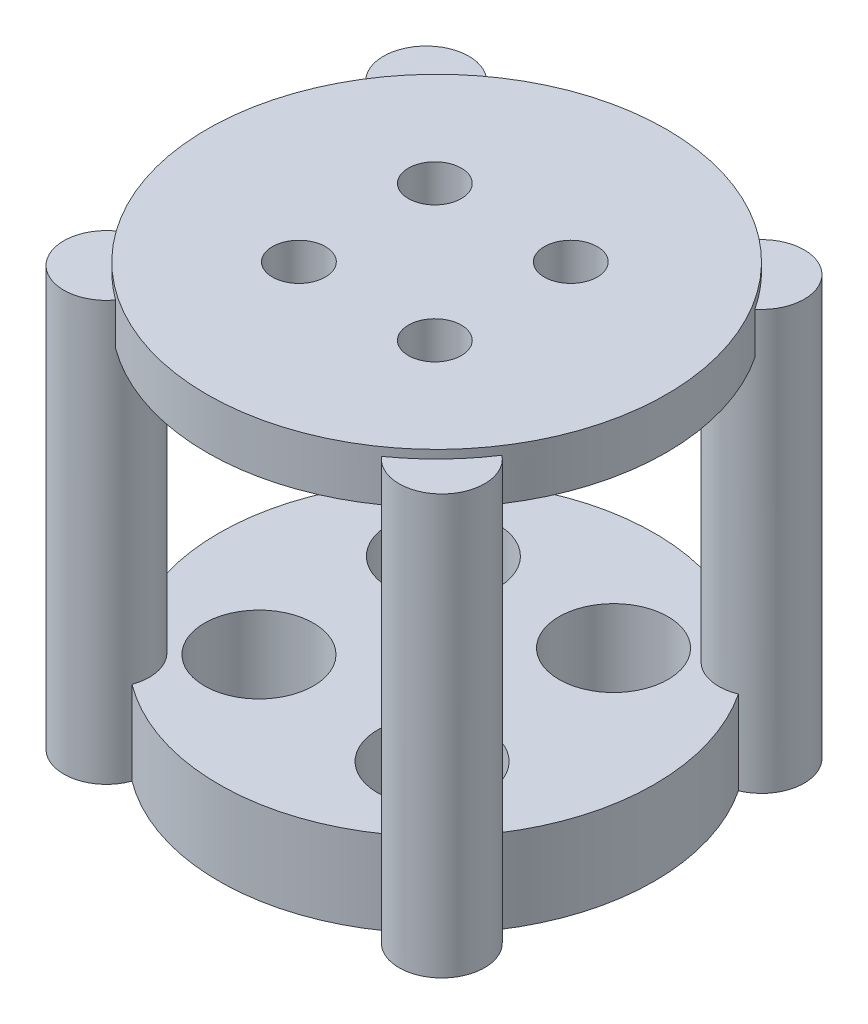
ISO-10303-21;
HEADER;
FILE_DESCRIPTION(('STEP AP214'),'2;1');
FILE_NAME('part.step','',(''),(''),'','','');
FILE_SCHEMA(('AUTOMOTIVE_DESIGN { 1 0 10303 214 1 1 1 1 }'));
ENDSEC;
DATA;
#1=APPLICATION_CONTEXT('core data for automotive mechanical design processes');
#2=APPLICATION_PROTOCOL_DEFINITION('international standard','automotive_design',2000,#1);
#3=PRODUCT_CONTEXT('',#1,'mechanical');
#4=PRODUCT('Part','Part','',(#3));
#5=PRODUCT_RELATED_PRODUCT_CATEGORY('part','',(#4));
#6=PRODUCT_DEFINITION_FORMATION('','',#4);
#7=PRODUCT_DEFINITION_CONTEXT('part definition',#1,'design');
#8=PRODUCT_DEFINITION('design','',#6,#7);
#9=PRODUCT_DEFINITION_SHAPE('','',#8);
#10=(LENGTH_UNIT() NAMED_UNIT(*) SI_UNIT(.MILLI.,.METRE.));
#11=(NAMED_UNIT(*) PLANE_ANGLE_UNIT() SI_UNIT($,.RADIAN.));
#12=(NAMED_UNIT(*) SI_UNIT($,.STERADIAN.) SOLID_ANGLE_UNIT());
#13=UNCERTAINTY_MEASURE_WITH_UNIT(LENGTH_MEASURE(1.E-05),#10,'distance_accuracy_value','');
#14=(GEOMETRIC_REPRESENTATION_CONTEXT(3) GLOBAL_UNCERTAINTY_ASSIGNED_CONTEXT((#13)) GLOBAL_UNIT_ASSIGNED_CONTEXT((#10,
#11,#12)) REPRESENTATION_CONTEXT('',''));
#15=CARTESIAN_POINT('',(0.,0.,0.));
#16=DIRECTION('',(0.,0.,1.));
#17=DIRECTION('',(1.,0.,0.));
#18=AXIS2_PLACEMENT_3D('',#15,#16,#17);
#19=CARTESIAN_POINT('',(0.,10.,0.));
#20=DIRECTION('',(0.,-1.,0.));
#21=DIRECTION('',(0.,0.,-1.));
#22=AXIS2_PLACEMENT_3D('',#19,#20,#21);
#23=CYLINDRICAL_SURFACE('',#22,25.9690851786537);
#24=CARTESIAN_POINT('',(0.,0.,0.));
#25=DIRECTION('',(0.,1.,0.));
#26=DIRECTION('',(0.,0.,1.));
#27=AXIS2_PLACEMENT_3D('',#24,#25,#26);
#28=CIRCLE('',#27,25.9690851786537);
#29=CARTESIAN_POINT('',(-15.5248521141573,0.,20.8175971680142));
#30=VERTEX_POINT('',#29);
#31=CARTESIAN_POINT('',(15.0373155756962,0.,21.1724473146846));
#32=VERTEX_POINT('',#31);
#33=EDGE_CURVE('E187',#30,#32,#28,.T.);
#34=ORIENTED_EDGE('',*,*,#33,.T.);
#35=DIRECTION('',(0.,-1.,0.));
#36=VECTOR('',#35,1.);
#37=CARTESIAN_POINT('',(15.0373155756962,25.,21.1724473146846));
#38=LINE('',#37,#36);
#39=CARTESIAN_POINT('',(15.0373155756962,10.,21.1724473146846));
#40=VERTEX_POINT('',#39);
#41=EDGE_CURVE('E237',#32,#40,#38,.F.);
#42=ORIENTED_EDGE('',*,*,#41,.T.);
#43=CARTESIAN_POINT('',(0.,10.,0.));
#44=DIRECTION('',(0.,1.,0.));
#45=DIRECTION('',(0.,0.,1.));
#46=AXIS2_PLACEMENT_3D('',#43,#44,#45);
#47=CIRCLE('',#46,25.9690851786537);
#48=CARTESIAN_POINT('',(-15.5248521141573,10.,20.8175971680142));
#49=VERTEX_POINT('',#48);
#50=EDGE_CURVE('E167',#49,#40,#47,.T.);
#51=ORIENTED_EDGE('',*,*,#50,.F.);
#52=DIRECTION('',(0.,-1.,0.));
#53=VECTOR('',#52,1.);
#54=CARTESIAN_POINT('',(-15.5248521141574,25.,20.8175971680142));
#55=LINE('',#54,#53);
#56=EDGE_CURVE('E228',#49,#30,#55,.T.);
#57=ORIENTED_EDGE('',*,*,#56,.T.);
#58=EDGE_LOOP('',(#34,#42,#51,#57));
#59=FACE_BOUND('',#58,.T.);
#60=ADVANCED_FACE('F33',(#59),#23,.T.);
#61=CARTESIAN_POINT('',(-21.7610217360415,0.,-14.1722022995616));
#62=VERTEX_POINT('',#61);
#63=CARTESIAN_POINT('',(-21.7610217360415,0.,14.1722022995616));
#64=VERTEX_POINT('',#63);
#65=EDGE_CURVE('E186',#62,#64,#28,.T.);
#66=ORIENTED_EDGE('',*,*,#65,.T.);
#67=DIRECTION('',(0.,-1.,0.));
#68=VECTOR('',#67,1.);
#69=CARTESIAN_POINT('',(-21.7610217360415,25.,14.1722022995616));
#70=LINE('',#69,#68);
#71=CARTESIAN_POINT('',(-21.7610217360415,10.,14.1722022995616));
#72=VERTEX_POINT('',#71);
#73=EDGE_CURVE('E224',#64,#72,#70,.F.);
#74=ORIENTED_EDGE('',*,*,#73,.T.);
#75=CARTESIAN_POINT('',(-21.7610217360415,10.,-14.1722022995616));
#76=VERTEX_POINT('',#75);
#77=EDGE_CURVE('E166',#76,#72,#47,.T.);
#78=ORIENTED_EDGE('',*,*,#77,.F.);
#79=DIRECTION('',(0.,-1.,0.));
#80=VECTOR('',#79,1.);
#81=CARTESIAN_POINT('',(-21.7610217360415,25.,-14.1722022995616));
#82=LINE('',#81,#80);
#83=EDGE_CURVE('E204',#62,#76,#82,.F.);
#84=ORIENTED_EDGE('',*,*,#83,.F.);
#85=EDGE_LOOP('',(#66,#74,#78,#84));
#86=FACE_BOUND('',#85,.T.);
#87=ADVANCED_FACE('F340',(#86),#23,.T.);
#88=CARTESIAN_POINT('',(21.6415336495583,10.,14.3540031458546));
#89=VERTEX_POINT('',#88);
#90=CARTESIAN_POINT('',(21.6415336495583,10.,-14.3540031458546));
#91=VERTEX_POINT('',#90);
#92=EDGE_CURVE('E169',#89,#91,#47,.T.);
#93=ORIENTED_EDGE('',*,*,#92,.F.);
#94=DIRECTION('',(0.,-1.,0.));
#95=VECTOR('',#94,1.);
#96=CARTESIAN_POINT('',(21.6415336495583,25.,14.3540031458546));
#97=LINE('',#96,#95);
#98=CARTESIAN_POINT('',(21.6415336495583,0.,14.3540031458546));
#99=VERTEX_POINT('',#98);
#100=EDGE_CURVE('E242',#89,#99,#97,.T.);
#101=ORIENTED_EDGE('',*,*,#100,.T.);
#102=CARTESIAN_POINT('',(21.6415336495583,0.,-14.3540031458546));
#103=VERTEX_POINT('',#102);
#104=EDGE_CURVE('E188',#99,#103,#28,.T.);
#105=ORIENTED_EDGE('',*,*,#104,.T.);
#106=DIRECTION('',(0.,-1.,0.));
#107=VECTOR('',#106,1.);
#108=CARTESIAN_POINT('',(21.6415336495583,25.,-14.3540031458546));
#109=LINE('',#108,#107);
#110=EDGE_CURVE('E212',#91,#103,#109,.T.);
#111=ORIENTED_EDGE('',*,*,#110,.F.);
#112=EDGE_LOOP('',(#93,#101,#105,#111));
#113=FACE_BOUND('',#112,.T.);
#114=ADVANCED_FACE('F35',(#113),#23,.T.);
#115=DIRECTION('',(0.,-1.,0.));
#116=VECTOR('',#115,1.);
#117=CARTESIAN_POINT('',(15.0373155756962,25.,-21.1724473146846));
#118=LINE('',#117,#116);
#119=CARTESIAN_POINT('',(15.0373155756962,0.,-21.1724473146846));
#120=VERTEX_POINT('',#119);
#121=CARTESIAN_POINT('',(15.0373155756962,10.,-21.1724473146846));
#122=VERTEX_POINT('',#121);
#123=EDGE_CURVE('E216',#120,#122,#118,.F.);
#124=ORIENTED_EDGE('',*,*,#123,.F.);
#125=CARTESIAN_POINT('',(-15.5248521141574,0.,-20.8175971680142));
#126=VERTEX_POINT('',#125);
#127=EDGE_CURVE('E175',#120,#126,#28,.T.);
#128=ORIENTED_EDGE('',*,*,#127,.T.);
#129=DIRECTION('',(0.,-1.,0.));
#130=VECTOR('',#129,1.);
#131=CARTESIAN_POINT('',(-15.5248521141574,25.,-20.8175971680142));
#132=LINE('',#131,#130);
#133=CARTESIAN_POINT('',(-15.5248521141573,10.,-20.8175971680142));
#134=VERTEX_POINT('',#133);
#135=EDGE_CURVE('E197',#134,#126,#132,.T.);
#136=ORIENTED_EDGE('',*,*,#135,.F.);
#137=EDGE_CURVE('E170',#122,#134,#47,.T.);
#138=ORIENTED_EDGE('',*,*,#137,.F.);
#139=EDGE_LOOP('',(#124,#128,#136,#138));
#140=FACE_BOUND('',#139,.T.);
#141=ADVANCED_FACE('F346',(#140),#23,.T.);
#142=CARTESIAN_POINT('',(0.,10.,0.));
#143=DIRECTION('',(0.,1.,0.));
#144=DIRECTION('',(0.,0.,1.));
#145=AXIS2_PLACEMENT_3D('',#142,#143,#144);
#146=PLANE('',#145);
#147=CARTESIAN_POINT('',(19.6836744663351,10.,19.0652406108791));
#148=DIRECTION('',(0.,1.,0.));
#149=DIRECTION('',(0.,0.,1.));
#150=AXIS2_PLACEMENT_3D('',#147,#148,#149);
#151=CIRCLE('',#150,5.10185956619563);
#152=EDGE_CURVE('E150',#89,#40,#151,.T.);
#153=ORIENTED_EDGE('',*,*,#152,.F.);
#154=ORIENTED_EDGE('',*,*,#92,.T.);
#155=CARTESIAN_POINT('',(19.6836744663351,10.,-19.0652406108791));
#156=DIRECTION('',(0.,1.,0.));
#157=DIRECTION('',(0.,0.,1.));
#158=AXIS2_PLACEMENT_3D('',#155,#156,#157);
#159=CIRCLE('',#158,5.10185956619563);
#160=EDGE_CURVE('E218',#91,#122,#159,.F.);
#161=ORIENTED_EDGE('',*,*,#160,.T.);
#162=ORIENTED_EDGE('',*,*,#137,.T.);
#163=CARTESIAN_POINT('',(-20.3163255336649,10.,-19.0652406108791));
#164=DIRECTION('',(0.,1.,0.));
#165=DIRECTION('',(0.,0.,1.));
#166=AXIS2_PLACEMENT_3D('',#163,#164,#165);
#167=CIRCLE('',#166,5.10185956619563);
#168=EDGE_CURVE('E206',#134,#76,#167,.F.);
#169=ORIENTED_EDGE('',*,*,#168,.T.);
#170=ORIENTED_EDGE('',*,*,#77,.T.);
#171=CARTESIAN_POINT('',(-20.3163255336649,10.,19.0652406108791));
#172=DIRECTION('',(0.,1.,0.));
#173=DIRECTION('',(0.,0.,1.));
#174=AXIS2_PLACEMENT_3D('',#171,#172,#173);
#175=CIRCLE('',#174,5.10185956619563);
#176=EDGE_CURVE('E230',#49,#72,#175,.T.);
#177=ORIENTED_EDGE('',*,*,#176,.F.);
#178=ORIENTED_EDGE('',*,*,#50,.T.);
#179=EDGE_LOOP('',(#153,#154,#161,#162,#169,#170,#177,#178));
#180=FACE_BOUND('',#179,.T.);
#181=CARTESIAN_POINT('',(9.44894330462829,10.,-11.6497841364516));
#182=DIRECTION('',(0.,1.,0.));
#183=DIRECTION('',(0.,0.,1.));
#184=AXIS2_PLACEMENT_3D('',#181,#182,#183);
#185=CIRCLE('',#184,6.5);
#186=CARTESIAN_POINT('',(9.44894330462829,10.,-5.14978413645163));
#187=VERTEX_POINT('',#186);
#188=EDGE_CURVE('E193',#187,#187,#185,.T.);
#189=ORIENTED_EDGE('',*,*,#188,.F.);
#190=EDGE_LOOP('',(#189));
#191=FACE_BOUND('',#190,.T.);
#192=CARTESIAN_POINT('',(10.3303987443531,10.,10.8757924668811));
#193=DIRECTION('',(0.,1.,0.));
#194=DIRECTION('',(0.,0.,1.));
#195=AXIS2_PLACEMENT_3D('',#192,#193,#194);
#196=CIRCLE('',#195,6.5);
#197=CARTESIAN_POINT('',(10.3303987443531,10.,17.3757924668811));
#198=VERTEX_POINT('',#197);
#199=EDGE_CURVE('E196',#198,#198,#196,.T.);
#200=ORIENTED_EDGE('',*,*,#199,.F.);
#201=EDGE_LOOP('',(#200));
#202=FACE_BOUND('',#201,.T.);
#203=CARTESIAN_POINT('',(-11.0323902751601,10.,10.1629899545632));
#204=DIRECTION('',(0.,1.,0.));
#205=DIRECTION('',(0.,0.,1.));
#206=AXIS2_PLACEMENT_3D('',#203,#204,#205);
#207=CIRCLE('',#206,6.5);
#208=CARTESIAN_POINT('',(-11.0323902751601,10.,16.6629899545633));
#209=VERTEX_POINT('',#208);
#210=EDGE_CURVE('E192',#209,#209,#207,.T.);
#211=ORIENTED_EDGE('',*,*,#210,.F.);
#212=EDGE_LOOP('',(#211));
#213=FACE_BOUND('',#212,.T.);
#214=CARTESIAN_POINT('',(-10.1971970596154,10.,-11.0007805235525));
#215=DIRECTION('',(0.,1.,0.));
#216=DIRECTION('',(0.,0.,1.));
#217=AXIS2_PLACEMENT_3D('',#214,#215,#216);
#218=CIRCLE('',#217,6.5);
#219=CARTESIAN_POINT('',(-10.1971970596154,10.,-4.50078052355245));
#220=VERTEX_POINT('',#219);
#221=EDGE_CURVE('E185',#220,#220,#218,.T.);
#222=ORIENTED_EDGE('',*,*,#221,.F.);
#223=EDGE_LOOP('',(#222));
#224=FACE_BOUND('',#223,.T.);
#225=ADVANCED_FACE('F352',(#180,#191,#202,#213,#224),#146,.T.);
#226=CARTESIAN_POINT('',(0.,0.,0.));
#227=DIRECTION('',(0.,1.,0.));
#228=DIRECTION('',(0.,0.,1.));
#229=AXIS2_PLACEMENT_3D('',#226,#227,#228);
#230=PLANE('',#229);
#231=ORIENTED_EDGE('',*,*,#104,.F.);
#232=CARTESIAN_POINT('',(19.6836744663351,0.,19.0652406108791));
#233=DIRECTION('',(0.,-1.,0.));
#234=DIRECTION('',(0.,0.,-1.));
#235=AXIS2_PLACEMENT_3D('',#232,#233,#234);
#236=CIRCLE('',#235,5.10185956619563);
#237=EDGE_CURVE('E151',#99,#32,#236,.T.);
#238=ORIENTED_EDGE('',*,*,#237,.T.);
#239=ORIENTED_EDGE('',*,*,#33,.F.);
#240=CARTESIAN_POINT('',(-20.3163255336649,0.,19.0652406108791));
#241=DIRECTION('',(0.,-1.,0.));
#242=DIRECTION('',(0.,0.,-1.));
#243=AXIS2_PLACEMENT_3D('',#240,#241,#242);
#244=CIRCLE('',#243,5.10185956619563);
#245=EDGE_CURVE('E234',#30,#64,#244,.T.);
#246=ORIENTED_EDGE('',*,*,#245,.T.);
#247=ORIENTED_EDGE('',*,*,#65,.F.);
#248=CARTESIAN_POINT('',(-20.3163255336649,0.,-19.0652406108791));
#249=DIRECTION('',(0.,1.,0.));
#250=DIRECTION('',(0.,0.,1.));
#251=AXIS2_PLACEMENT_3D('',#248,#249,#250);
#252=CIRCLE('',#251,5.10185956619563);
#253=EDGE_CURVE('E210',#126,#62,#252,.T.);
#254=ORIENTED_EDGE('',*,*,#253,.F.);
#255=ORIENTED_EDGE('',*,*,#127,.F.);
#256=CARTESIAN_POINT('',(19.6836744663351,0.,-19.0652406108791));
#257=DIRECTION('',(0.,1.,0.));
#258=DIRECTION('',(0.,0.,1.));
#259=AXIS2_PLACEMENT_3D('',#256,#257,#258);
#260=CIRCLE('',#259,5.10185956619563);
#261=EDGE_CURVE('E222',#103,#120,#260,.T.);
#262=ORIENTED_EDGE('',*,*,#261,.F.);
#263=EDGE_LOOP('',(#231,#238,#239,#246,#247,#254,#255,#262));
#264=FACE_BOUND('',#263,.T.);
#265=CARTESIAN_POINT('',(9.44894330462829,0.,-11.6497841364516));
#266=DIRECTION('',(0.,1.,0.));
#267=DIRECTION('',(0.,0.,1.));
#268=AXIS2_PLACEMENT_3D('',#265,#266,#267);
#269=CIRCLE('',#268,6.5);
#270=CARTESIAN_POINT('',(9.44894330462829,0.,-5.14978413645163));
#271=VERTEX_POINT('',#270);
#272=EDGE_CURVE('E172',#271,#271,#269,.F.);
#273=ORIENTED_EDGE('',*,*,#272,.F.);
#274=EDGE_LOOP('',(#273));
#275=FACE_BOUND('',#274,.T.);
#276=CARTESIAN_POINT('',(10.3303987443531,0.,10.8757924668811));
#277=DIRECTION('',(0.,1.,0.));
#278=DIRECTION('',(0.,0.,1.));
#279=AXIS2_PLACEMENT_3D('',#276,#277,#278);
#280=CIRCLE('',#279,6.5);
#281=CARTESIAN_POINT('',(10.3303987443531,0.,17.3757924668811));
#282=VERTEX_POINT('',#281);
#283=EDGE_CURVE('E176',#282,#282,#280,.F.);
#284=ORIENTED_EDGE('',*,*,#283,.F.);
#285=EDGE_LOOP('',(#284));
#286=FACE_BOUND('',#285,.T.);
#287=CARTESIAN_POINT('',(-11.0323902751601,0.,10.1629899545632));
#288=DIRECTION('',(0.,1.,0.));
#289=DIRECTION('',(0.,0.,1.));
#290=AXIS2_PLACEMENT_3D('',#287,#288,#289);
#291=CIRCLE('',#290,6.5);
#292=CARTESIAN_POINT('',(-11.0323902751601,0.,16.6629899545633));
#293=VERTEX_POINT('',#292);
#294=EDGE_CURVE('E179',#293,#293,#291,.F.);
#295=ORIENTED_EDGE('',*,*,#294,.F.);
#296=EDGE_LOOP('',(#295));
#297=FACE_BOUND('',#296,.T.);
#298=CARTESIAN_POINT('',(-10.1971970596154,0.,-11.0007805235525));
#299=DIRECTION('',(0.,1.,0.));
#300=DIRECTION('',(0.,0.,1.));
#301=AXIS2_PLACEMENT_3D('',#298,#299,#300);
#302=CIRCLE('',#301,6.5);
#303=CARTESIAN_POINT('',(-10.1971970596154,0.,-4.50078052355245));
#304=VERTEX_POINT('',#303);
#305=EDGE_CURVE('E182',#304,#304,#302,.F.);
#306=ORIENTED_EDGE('',*,*,#305,.F.);
#307=EDGE_LOOP('',(#306));
#308=FACE_BOUND('',#307,.T.);
#309=ADVANCED_FACE('F364',(#264,#275,#286,#297,#308),#230,.F.);
#310=CARTESIAN_POINT('',(-10.1971970596154,10.,-11.0007805235525));
#311=DIRECTION('',(0.,-1.,0.));
#312=DIRECTION('',(0.,0.,-1.));
#313=AXIS2_PLACEMENT_3D('',#310,#311,#312);
#314=CYLINDRICAL_SURFACE('',#313,6.5);
#315=ORIENTED_EDGE('',*,*,#221,.T.);
#316=EDGE_LOOP('',(#315));
#317=FACE_BOUND('',#316,.T.);
#318=ORIENTED_EDGE('',*,*,#305,.T.);
#319=EDGE_LOOP('',(#318));
#320=FACE_BOUND('',#319,.T.);
#321=ADVANCED_FACE('F409',(#317,#320),#314,.F.);
#322=CARTESIAN_POINT('',(-11.0323902751601,10.,10.1629899545632));
#323=DIRECTION('',(0.,-1.,0.));
#324=DIRECTION('',(0.,0.,-1.));
#325=AXIS2_PLACEMENT_3D('',#322,#323,#324);
#326=CYLINDRICAL_SURFACE('',#325,6.5);
#327=ORIENTED_EDGE('',*,*,#210,.T.);
#328=EDGE_LOOP('',(#327));
#329=FACE_BOUND('',#328,.T.);
#330=ORIENTED_EDGE('',*,*,#294,.T.);
#331=EDGE_LOOP('',(#330));
#332=FACE_BOUND('',#331,.T.);
#333=ADVANCED_FACE('F405',(#329,#332),#326,.F.);
#334=CARTESIAN_POINT('',(10.3303987443531,10.,10.8757924668811));
#335=DIRECTION('',(0.,-1.,0.));
#336=DIRECTION('',(0.,0.,-1.));
#337=AXIS2_PLACEMENT_3D('',#334,#335,#336);
#338=CYLINDRICAL_SURFACE('',#337,6.5);
#339=ORIENTED_EDGE('',*,*,#199,.T.);
#340=EDGE_LOOP('',(#339));
#341=FACE_BOUND('',#340,.T.);
#342=ORIENTED_EDGE('',*,*,#283,.T.);
#343=EDGE_LOOP('',(#342));
#344=FACE_BOUND('',#343,.T.);
#345=ADVANCED_FACE('F408',(#341,#344),#338,.F.);
#346=CARTESIAN_POINT('',(9.44894330462829,10.,-11.6497841364516));
#347=DIRECTION('',(0.,-1.,0.));
#348=DIRECTION('',(0.,0.,-1.));
#349=AXIS2_PLACEMENT_3D('',#346,#347,#348);
#350=CYLINDRICAL_SURFACE('',#349,6.5);
#351=ORIENTED_EDGE('',*,*,#188,.T.);
#352=EDGE_LOOP('',(#351));
#353=FACE_BOUND('',#352,.T.);
#354=ORIENTED_EDGE('',*,*,#272,.T.);
#355=EDGE_LOOP('',(#354));
#356=FACE_BOUND('',#355,.T.);
#357=ADVANCED_FACE('F404',(#353,#356),#350,.F.);
#358=CARTESIAN_POINT('',(-20.3163255336649,50.,-19.0652406108791));
#359=DIRECTION('',(0.,-1.,0.));
#360=DIRECTION('',(0.,0.,-1.));
#361=AXIS2_PLACEMENT_3D('',#358,#359,#360);
#362=CYLINDRICAL_SURFACE('',#361,5.10185956619563);
#363=CARTESIAN_POINT('',(-20.3163255336649,45.,-19.0652406108791));
#364=DIRECTION('',(0.,1.,0.));
#365=DIRECTION('',(0.,0.,1.));
#366=AXIS2_PLACEMENT_3D('',#363,#364,#365);
#367=CIRCLE('',#366,5.10185956619563);
#368=CARTESIAN_POINT('',(-23.0783347401529,45.,-14.7756863011102));
#369=VERTEX_POINT('',#368);
#370=CARTESIAN_POINT('',(-16.2107324151479,45.,-22.0939492760312));
#371=VERTEX_POINT('',#370);
#372=EDGE_CURVE('E52',#369,#371,#367,.T.);
#373=ORIENTED_EDGE('',*,*,#372,.F.);
#374=DIRECTION('',(0.,1.,0.));
#375=VECTOR('',#374,1.);
#376=CARTESIAN_POINT('',(-23.078334740153,47.5,-14.7756863011102));
#377=LINE('',#376,#375);
#378=CARTESIAN_POINT('',(-23.078334740153,50.,-14.7756863011102));
#379=VERTEX_POINT('',#378);
#380=EDGE_CURVE('E254',#369,#379,#377,.T.);
#381=ORIENTED_EDGE('',*,*,#380,.T.);
#382=CARTESIAN_POINT('',(-20.3163255336649,50.,-19.0652406108791));
#383=DIRECTION('',(0.,1.,0.));
#384=DIRECTION('',(0.,0.,1.));
#385=AXIS2_PLACEMENT_3D('',#382,#383,#384);
#386=CIRCLE('',#385,5.10185956619563);
#387=CARTESIAN_POINT('',(-16.2107324151479,50.,-22.0939492760312));
#388=VERTEX_POINT('',#387);
#389=EDGE_CURVE('E209',#388,#379,#386,.T.);
#390=ORIENTED_EDGE('',*,*,#389,.F.);
#391=DIRECTION('',(0.,1.,0.));
#392=VECTOR('',#391,1.);
#393=CARTESIAN_POINT('',(-16.2107324151479,47.5,-22.0939492760312));
#394=LINE('',#393,#392);
#395=EDGE_CURVE('E48',#388,#371,#394,.F.);
#396=ORIENTED_EDGE('',*,*,#395,.T.);
#397=EDGE_LOOP('',(#373,#381,#390,#396));
#398=FACE_BOUND('',#397,.T.);
#399=ORIENTED_EDGE('',*,*,#168,.F.);
#400=ORIENTED_EDGE('',*,*,#135,.T.);
#401=ORIENTED_EDGE('',*,*,#253,.T.);
#402=ORIENTED_EDGE('',*,*,#83,.T.);
#403=EDGE_LOOP('',(#399,#400,#401,#402));
#404=FACE_BOUND('',#403,.T.);
#405=ADVANCED_FACE('F375',(#398,#404),#362,.T.);
#406=CARTESIAN_POINT('',(-20.3163255336649,50.,-19.0652406108791));
#407=DIRECTION('',(0.,1.,0.));
#408=DIRECTION('',(0.,0.,1.));
#409=AXIS2_PLACEMENT_3D('',#406,#407,#408);
#410=PLANE('',#409);
#411=CARTESIAN_POINT('',(0.,50.,0.));
#412=DIRECTION('',(0.,1.,0.));
#413=DIRECTION('',(0.,0.,1.));
#414=AXIS2_PLACEMENT_3D('',#411,#412,#413);
#415=CIRCLE('',#414,27.4031100433393);
#416=EDGE_CURVE('E257',#388,#379,#415,.T.);
#417=ORIENTED_EDGE('',*,*,#416,.F.);
#418=ORIENTED_EDGE('',*,*,#389,.T.);
#419=EDGE_LOOP('',(#417,#418));
#420=FACE_BOUND('',#419,.T.);
#421=ADVANCED_FACE('F389',(#420),#410,.T.);
#422=CARTESIAN_POINT('',(19.6836744663351,50.,-19.0652406108791));
#423=DIRECTION('',(0.,-1.,0.));
#424=DIRECTION('',(0.,0.,-1.));
#425=AXIS2_PLACEMENT_3D('',#422,#423,#424);
#426=CYLINDRICAL_SURFACE('',#425,5.10185956619563);
#427=CARTESIAN_POINT('',(19.6836744663351,45.,-19.0652406108791));
#428=DIRECTION('',(0.,1.,0.));
#429=DIRECTION('',(0.,0.,1.));
#430=AXIS2_PLACEMENT_3D('',#427,#428,#429);
#431=CIRCLE('',#430,5.10185956619563);
#432=CARTESIAN_POINT('',(15.8084159479153,45.,-22.3835748991323));
#433=VERTEX_POINT('',#432);
#434=CARTESIAN_POINT('',(22.8766516905268,45.,-15.0860613639772));
#435=VERTEX_POINT('',#434);
#436=EDGE_CURVE('E249',#433,#435,#431,.T.);
#437=ORIENTED_EDGE('',*,*,#436,.F.);
#438=DIRECTION('',(0.,1.,0.));
#439=VECTOR('',#438,1.);
#440=CARTESIAN_POINT('',(15.8084159479153,47.5,-22.3835748991323));
#441=LINE('',#440,#439);
#442=CARTESIAN_POINT('',(15.8084159479153,50.,-22.3835748991323));
#443=VERTEX_POINT('',#442);
#444=EDGE_CURVE('E260',#433,#443,#441,.T.);
#445=ORIENTED_EDGE('',*,*,#444,.T.);
#446=CARTESIAN_POINT('',(19.6836744663351,50.,-19.0652406108791));
#447=DIRECTION('',(0.,1.,0.));
#448=DIRECTION('',(0.,0.,1.));
#449=AXIS2_PLACEMENT_3D('',#446,#447,#448);
#450=CIRCLE('',#449,5.10185956619563);
#451=CARTESIAN_POINT('',(22.8766516905268,50.,-15.0860613639772));
#452=VERTEX_POINT('',#451);
#453=EDGE_CURVE('E221',#452,#443,#450,.T.);
#454=ORIENTED_EDGE('',*,*,#453,.F.);
#455=DIRECTION('',(0.,1.,0.));
#456=VECTOR('',#455,1.);
#457=CARTESIAN_POINT('',(22.8766516905268,47.5,-15.0860613639772));
#458=LINE('',#457,#456);
#459=EDGE_CURVE('E263',#452,#435,#458,.F.);
#460=ORIENTED_EDGE('',*,*,#459,.T.);
#461=EDGE_LOOP('',(#437,#445,#454,#460));
#462=FACE_BOUND('',#461,.T.);
#463=ORIENTED_EDGE('',*,*,#160,.F.);
#464=ORIENTED_EDGE('',*,*,#110,.T.);
#465=ORIENTED_EDGE('',*,*,#261,.T.);
#466=ORIENTED_EDGE('',*,*,#123,.T.);
#467=EDGE_LOOP('',(#463,#464,#465,#466));
#468=FACE_BOUND('',#467,.T.);
#469=ADVANCED_FACE('F386',(#462,#468),#426,.T.);
#470=CARTESIAN_POINT('',(19.6836744663351,50.,-19.0652406108791));
#471=DIRECTION('',(0.,1.,0.));
#472=DIRECTION('',(0.,0.,1.));
#473=AXIS2_PLACEMENT_3D('',#470,#471,#472);
#474=PLANE('',#473);
#475=CARTESIAN_POINT('',(0.,50.,0.));
#476=DIRECTION('',(0.,1.,0.));
#477=DIRECTION('',(0.,0.,1.));
#478=AXIS2_PLACEMENT_3D('',#475,#476,#477);
#479=CIRCLE('',#478,27.4031100433393);
#480=EDGE_CURVE('E265',#452,#443,#479,.T.);
#481=ORIENTED_EDGE('',*,*,#480,.F.);
#482=ORIENTED_EDGE('',*,*,#453,.T.);
#483=EDGE_LOOP('',(#481,#482));
#484=FACE_BOUND('',#483,.T.);
#485=ADVANCED_FACE('F388',(#484),#474,.T.);
#486=CARTESIAN_POINT('',(-20.3163255336649,50.,19.0652406108791));
#487=DIRECTION('',(0.,-1.,0.));
#488=DIRECTION('',(0.,0.,-1.));
#489=AXIS2_PLACEMENT_3D('',#486,#487,#488);
#490=CYLINDRICAL_SURFACE('',#489,5.10185956619563);
#491=DIRECTION('',(0.,1.,0.));
#492=VECTOR('',#491,1.);
#493=CARTESIAN_POINT('',(-16.2107324151479,48.,22.0939492760312));
#494=LINE('',#493,#492);
#495=CARTESIAN_POINT('',(-16.2107324151479,50.,22.0939492760312));
#496=VERTEX_POINT('',#495);
#497=CARTESIAN_POINT('',(-16.2107324151479,45.,22.0939492760312));
#498=VERTEX_POINT('',#497);
#499=EDGE_CURVE('E268',#496,#498,#494,.F.);
#500=ORIENTED_EDGE('',*,*,#499,.F.);
#501=CARTESIAN_POINT('',(-20.3163255336649,50.,19.0652406108791));
#502=DIRECTION('',(0.,-1.,0.));
#503=DIRECTION('',(0.,0.,-1.));
#504=AXIS2_PLACEMENT_3D('',#501,#502,#503);
#505=CIRCLE('',#504,5.10185956619563);
#506=CARTESIAN_POINT('',(-23.078334740153,50.,14.7756863011102));
#507=VERTEX_POINT('',#506);
#508=EDGE_CURVE('E233',#496,#507,#505,.T.);
#509=ORIENTED_EDGE('',*,*,#508,.T.);
#510=DIRECTION('',(0.,1.,0.));
#511=VECTOR('',#510,1.);
#512=CARTESIAN_POINT('',(-23.078334740153,48.,14.7756863011102));
#513=LINE('',#512,#511);
#514=CARTESIAN_POINT('',(-23.0783347401529,45.,14.7756863011102));
#515=VERTEX_POINT('',#514);
#516=EDGE_CURVE('E271',#515,#507,#513,.T.);
#517=ORIENTED_EDGE('',*,*,#516,.F.);
#518=CARTESIAN_POINT('',(-20.3163255336649,45.,19.0652406108791));
#519=DIRECTION('',(0.,1.,0.));
#520=DIRECTION('',(0.,0.,1.));
#521=AXIS2_PLACEMENT_3D('',#518,#519,#520);
#522=CIRCLE('',#521,5.10185956619563);
#523=EDGE_CURVE('E252',#515,#498,#522,.F.);
#524=ORIENTED_EDGE('',*,*,#523,.T.);
#525=EDGE_LOOP('',(#500,#509,#517,#524));
#526=FACE_BOUND('',#525,.T.);
#527=ORIENTED_EDGE('',*,*,#73,.F.);
#528=ORIENTED_EDGE('',*,*,#245,.F.);
#529=ORIENTED_EDGE('',*,*,#56,.F.);
#530=ORIENTED_EDGE('',*,*,#176,.T.);
#531=EDGE_LOOP('',(#527,#528,#529,#530));
#532=FACE_BOUND('',#531,.T.);
#533=ADVANCED_FACE('F381',(#526,#532),#490,.T.);
#534=CARTESIAN_POINT('',(-20.3163255336649,50.,19.0652406108791));
#535=DIRECTION('',(0.,1.,0.));
#536=DIRECTION('',(0.,0.,-1.));
#537=AXIS2_PLACEMENT_3D('',#534,#535,#536);
#538=PLANE('',#537);
#539=CARTESIAN_POINT('',(0.,50.,0.));
#540=DIRECTION('',(0.,1.,0.));
#541=DIRECTION('',(0.,0.,1.));
#542=AXIS2_PLACEMENT_3D('',#539,#540,#541);
#543=CIRCLE('',#542,27.4031100433393);
#544=EDGE_CURVE('E161',#507,#496,#543,.T.);
#545=ORIENTED_EDGE('',*,*,#544,.F.);
#546=ORIENTED_EDGE('',*,*,#508,.F.);
#547=EDGE_LOOP('',(#545,#546));
#548=FACE_BOUND('',#547,.T.);
#549=ADVANCED_FACE('F471',(#548),#538,.T.);
#550=CARTESIAN_POINT('',(19.6836744663351,50.,19.0652406108791));
#551=DIRECTION('',(0.,-1.,0.));
#552=DIRECTION('',(0.,0.,-1.));
#553=AXIS2_PLACEMENT_3D('',#550,#551,#552);
#554=CYLINDRICAL_SURFACE('',#553,5.10185956619563);
#555=DIRECTION('',(0.,1.,0.));
#556=VECTOR('',#555,1.);
#557=CARTESIAN_POINT('',(22.8766516905268,48.,15.0860613639772));
#558=LINE('',#557,#556);
#559=CARTESIAN_POINT('',(22.8766516905268,50.,15.0860613639772));
#560=VERTEX_POINT('',#559);
#561=CARTESIAN_POINT('',(22.8766516905268,45.,15.0860613639772));
#562=VERTEX_POINT('',#561);
#563=EDGE_CURVE('E154',#560,#562,#558,.F.);
#564=ORIENTED_EDGE('',*,*,#563,.F.);
#565=CARTESIAN_POINT('',(19.6836744663351,50.,19.0652406108791));
#566=DIRECTION('',(0.,-1.,0.));
#567=DIRECTION('',(0.,0.,-1.));
#568=AXIS2_PLACEMENT_3D('',#565,#566,#567);
#569=CIRCLE('',#568,5.10185956619563);
#570=CARTESIAN_POINT('',(15.8084159479153,50.,22.3835748991323));
#571=VERTEX_POINT('',#570);
#572=EDGE_CURVE('E144',#560,#571,#569,.T.);
#573=ORIENTED_EDGE('',*,*,#572,.T.);
#574=DIRECTION('',(0.,1.,0.));
#575=VECTOR('',#574,1.);
#576=CARTESIAN_POINT('',(15.8084159479153,48.,22.3835748991323));
#577=LINE('',#576,#575);
#578=CARTESIAN_POINT('',(15.8084159479153,45.,22.3835748991323));
#579=VERTEX_POINT('',#578);
#580=EDGE_CURVE('E162',#579,#571,#577,.T.);
#581=ORIENTED_EDGE('',*,*,#580,.F.);
#582=CARTESIAN_POINT('',(19.6836744663351,45.,19.0652406108791));
#583=DIRECTION('',(0.,1.,0.));
#584=DIRECTION('',(0.,0.,1.));
#585=AXIS2_PLACEMENT_3D('',#582,#583,#584);
#586=CIRCLE('',#585,5.10185956619563);
#587=EDGE_CURVE('E11',#579,#562,#586,.F.);
#588=ORIENTED_EDGE('',*,*,#587,.T.);
#589=EDGE_LOOP('',(#564,#573,#581,#588));
#590=FACE_BOUND('',#589,.T.);
#591=ORIENTED_EDGE('',*,*,#41,.F.);
#592=ORIENTED_EDGE('',*,*,#237,.F.);
#593=ORIENTED_EDGE('',*,*,#100,.F.);
#594=ORIENTED_EDGE('',*,*,#152,.T.);
#595=EDGE_LOOP('',(#591,#592,#593,#594));
#596=FACE_BOUND('',#595,.T.);
#597=ADVANCED_FACE('F155',(#590,#596),#554,.T.);
#598=CARTESIAN_POINT('',(19.6836744663351,50.,19.0652406108791));
#599=DIRECTION('',(0.,1.,0.));
#600=DIRECTION('',(0.,0.,-1.));
#601=AXIS2_PLACEMENT_3D('',#598,#599,#600);
#602=PLANE('',#601);
#603=CARTESIAN_POINT('',(0.,50.,0.));
#604=DIRECTION('',(0.,1.,0.));
#605=DIRECTION('',(0.,0.,1.));
#606=AXIS2_PLACEMENT_3D('',#603,#604,#605);
#607=CIRCLE('',#606,27.4031100433393);
#608=EDGE_CURVE('E41',#571,#560,#607,.T.);
#609=ORIENTED_EDGE('',*,*,#608,.F.);
#610=ORIENTED_EDGE('',*,*,#572,.F.);
#611=EDGE_LOOP('',(#609,#610));
#612=FACE_BOUND('',#611,.T.);
#613=ADVANCED_FACE('F146',(#612),#602,.T.);
#614=CARTESIAN_POINT('',(0.,45.,0.));
#615=DIRECTION('',(0.,1.,0.));
#616=DIRECTION('',(0.,0.,1.));
#617=AXIS2_PLACEMENT_3D('',#614,#615,#616);
#618=PLANE('',#617);
#619=CARTESIAN_POINT('',(-8.21520013782591,45.,-8.00000000001037));
#620=DIRECTION('',(0.,1.,0.));
#621=DIRECTION('',(1.,0.,0.));
#622=AXIS2_PLACEMENT_3D('',#619,#620,#621);
#623=CIRCLE('',#622,3.15689378879222);
#624=CARTESIAN_POINT('',(-5.05830634903369,45.,-8.00000000001038));
#625=VERTEX_POINT('',#624);
#626=EDGE_CURVE('E288',#625,#625,#623,.T.);
#627=ORIENTED_EDGE('',*,*,#626,.T.);
#628=EDGE_LOOP('',(#627));
#629=FACE_BOUND('',#628,.T.);
#630=CARTESIAN_POINT('',(-8.21520013787302,45.,8.21520013782526));
#631=DIRECTION('',(0.,1.,0.));
#632=DIRECTION('',(0.,0.,-1.));
#633=AXIS2_PLACEMENT_3D('',#630,#631,#632);
#634=CIRCLE('',#633,3.15689378879222);
#635=CARTESIAN_POINT('',(-8.21520013787302,45.,5.05830634903304));
#636=VERTEX_POINT('',#635);
#637=EDGE_CURVE('E300',#636,#636,#634,.T.);
#638=ORIENTED_EDGE('',*,*,#637,.T.);
#639=EDGE_LOOP('',(#638));
#640=FACE_BOUND('',#639,.T.);
#641=CARTESIAN_POINT('',(7.99999999996272,45.,8.21520013787232));
#642=DIRECTION('',(0.,1.,0.));
#643=DIRECTION('',(-1.,0.,0.));
#644=AXIS2_PLACEMENT_3D('',#641,#642,#643);
#645=CIRCLE('',#644,3.15689378879222);
#646=CARTESIAN_POINT('',(4.8431062111705,45.,8.21520013787235));
#647=VERTEX_POINT('',#646);
#648=EDGE_CURVE('E294',#647,#647,#645,.T.);
#649=ORIENTED_EDGE('',*,*,#648,.T.);
#650=EDGE_LOOP('',(#649));
#651=FACE_BOUND('',#650,.T.);
#652=CARTESIAN_POINT('',(8.00000000000978,45.,-7.99999999996326));
#653=DIRECTION('',(0.,1.,0.));
#654=DIRECTION('',(0.,0.,1.));
#655=AXIS2_PLACEMENT_3D('',#652,#653,#654);
#656=CIRCLE('',#655,3.15689378879222);
#657=CARTESIAN_POINT('',(8.00000000000978,45.,-4.84310621117104));
#658=VERTEX_POINT('',#657);
#659=EDGE_CURVE('E284',#658,#658,#656,.T.);
#660=ORIENTED_EDGE('',*,*,#659,.T.);
#661=EDGE_LOOP('',(#660));
#662=FACE_BOUND('',#661,.T.);
#663=CARTESIAN_POINT('',(0.,45.,0.));
#664=DIRECTION('',(0.,1.,0.));
#665=DIRECTION('',(0.,0.,1.));
#666=AXIS2_PLACEMENT_3D('',#663,#664,#665);
#667=CIRCLE('',#666,27.4031100433393);
#668=EDGE_CURVE('E280',#369,#515,#667,.T.);
#669=ORIENTED_EDGE('',*,*,#668,.F.);
#670=ORIENTED_EDGE('',*,*,#372,.T.);
#671=EDGE_CURVE('E562',#433,#371,#667,.T.);
#672=ORIENTED_EDGE('',*,*,#671,.F.);
#673=ORIENTED_EDGE('',*,*,#436,.T.);
#674=EDGE_CURVE('E277',#562,#435,#667,.T.);
#675=ORIENTED_EDGE('',*,*,#674,.F.);
#676=ORIENTED_EDGE('',*,*,#587,.F.);
#677=EDGE_CURVE('E278',#498,#579,#667,.T.);
#678=ORIENTED_EDGE('',*,*,#677,.F.);
#679=ORIENTED_EDGE('',*,*,#523,.F.);
#680=EDGE_LOOP('',(#669,#670,#672,#673,#675,#676,#678,#679));
#681=FACE_BOUND('',#680,.T.);
#682=ADVANCED_FACE('F309',(#629,#640,#651,#662,#681),#618,.F.);
#683=CARTESIAN_POINT('',(0.,45.,0.));
#684=DIRECTION('',(0.,1.,0.));
#685=DIRECTION('',(0.,0.,1.));
#686=AXIS2_PLACEMENT_3D('',#683,#684,#685);
#687=CYLINDRICAL_SURFACE('',#686,27.4031100433393);
#688=CARTESIAN_POINT('',(0.,51.,0.));
#689=DIRECTION('',(0.,1.,0.));
#690=DIRECTION('',(0.,0.,1.));
#691=AXIS2_PLACEMENT_3D('',#688,#689,#690);
#692=CIRCLE('',#691,27.4031100433393);
#693=CARTESIAN_POINT('',(0.,51.,27.4031100433393));
#694=VERTEX_POINT('',#693);
#695=EDGE_CURVE('E281',#694,#694,#692,.T.);
#696=ORIENTED_EDGE('',*,*,#695,.F.);
#697=EDGE_LOOP('',(#696));
#698=FACE_BOUND('',#697,.T.);
#699=ORIENTED_EDGE('',*,*,#380,.F.);
#700=ORIENTED_EDGE('',*,*,#668,.T.);
#701=ORIENTED_EDGE('',*,*,#516,.T.);
#702=ORIENTED_EDGE('',*,*,#544,.T.);
#703=ORIENTED_EDGE('',*,*,#499,.T.);
#704=ORIENTED_EDGE('',*,*,#677,.T.);
#705=ORIENTED_EDGE('',*,*,#580,.T.);
#706=ORIENTED_EDGE('',*,*,#608,.T.);
#707=ORIENTED_EDGE('',*,*,#563,.T.);
#708=ORIENTED_EDGE('',*,*,#674,.T.);
#709=ORIENTED_EDGE('',*,*,#459,.F.);
#710=ORIENTED_EDGE('',*,*,#480,.T.);
#711=ORIENTED_EDGE('',*,*,#444,.F.);
#712=ORIENTED_EDGE('',*,*,#671,.T.);
#713=ORIENTED_EDGE('',*,*,#395,.F.);
#714=ORIENTED_EDGE('',*,*,#416,.T.);
#715=EDGE_LOOP('',(#699,#700,#701,#702,#703,#704,#705,#706,#707,#708,#709,#710,#711,#712,#713,#714));
#716=FACE_BOUND('',#715,.T.);
#717=ADVANCED_FACE('F164',(#698,#716),#687,.T.);
#718=CARTESIAN_POINT('',(0.,51.,0.));
#719=DIRECTION('',(0.,1.,0.));
#720=DIRECTION('',(0.,0.,1.));
#721=AXIS2_PLACEMENT_3D('',#718,#719,#720);
#722=PLANE('',#721);
#723=CARTESIAN_POINT('',(-8.21520013782591,51.,-8.00000000001037));
#724=DIRECTION('',(0.,1.,0.));
#725=DIRECTION('',(1.,0.,0.));
#726=AXIS2_PLACEMENT_3D('',#723,#724,#725);
#727=CIRCLE('',#726,3.15689378879222);
#728=CARTESIAN_POINT('',(-5.05830634903369,51.,-8.00000000001038));
#729=VERTEX_POINT('',#728);
#730=EDGE_CURVE('E303',#729,#729,#727,.T.);
#731=ORIENTED_EDGE('',*,*,#730,.F.);
#732=EDGE_LOOP('',(#731));
#733=FACE_BOUND('',#732,.T.);
#734=CARTESIAN_POINT('',(-8.21520013787302,51.,8.21520013782526));
#735=DIRECTION('',(0.,1.,0.));
#736=DIRECTION('',(0.,0.,-1.));
#737=AXIS2_PLACEMENT_3D('',#734,#735,#736);
#738=CIRCLE('',#737,3.15689378879222);
#739=CARTESIAN_POINT('',(-8.21520013787302,51.,5.05830634903304));
#740=VERTEX_POINT('',#739);
#741=EDGE_CURVE('E297',#740,#740,#738,.T.);
#742=ORIENTED_EDGE('',*,*,#741,.F.);
#743=EDGE_LOOP('',(#742));
#744=FACE_BOUND('',#743,.T.);
#745=CARTESIAN_POINT('',(7.99999999996272,51.,8.21520013787232));
#746=DIRECTION('',(0.,1.,0.));
#747=DIRECTION('',(-1.,0.,0.));
#748=AXIS2_PLACEMENT_3D('',#745,#746,#747);
#749=CIRCLE('',#748,3.15689378879222);
#750=CARTESIAN_POINT('',(4.8431062111705,51.,8.21520013787235));
#751=VERTEX_POINT('',#750);
#752=EDGE_CURVE('E291',#751,#751,#749,.T.);
#753=ORIENTED_EDGE('',*,*,#752,.F.);
#754=EDGE_LOOP('',(#753));
#755=FACE_BOUND('',#754,.T.);
#756=CARTESIAN_POINT('',(8.00000000000978,51.,-7.99999999996326));
#757=DIRECTION('',(0.,1.,0.));
#758=DIRECTION('',(0.,0.,1.));
#759=AXIS2_PLACEMENT_3D('',#756,#757,#758);
#760=CIRCLE('',#759,3.15689378879222);
#761=CARTESIAN_POINT('',(8.00000000000978,51.,-4.84310621117104));
#762=VERTEX_POINT('',#761);
#763=EDGE_CURVE('E285',#762,#762,#760,.T.);
#764=ORIENTED_EDGE('',*,*,#763,.F.);
#765=EDGE_LOOP('',(#764));
#766=FACE_BOUND('',#765,.T.);
#767=ORIENTED_EDGE('',*,*,#695,.T.);
#768=EDGE_LOOP('',(#767));
#769=FACE_BOUND('',#768,.T.);
#770=ADVANCED_FACE('F319',(#733,#744,#755,#766,#769),#722,.T.);
#771=CARTESIAN_POINT('',(8.00000000000978,45.,-7.99999999996326));
#772=DIRECTION('',(0.,1.,0.));
#773=DIRECTION('',(0.,0.,1.));
#774=AXIS2_PLACEMENT_3D('',#771,#772,#773);
#775=CYLINDRICAL_SURFACE('',#774,3.15689378879222);
#776=ORIENTED_EDGE('',*,*,#659,.F.);
#777=EDGE_LOOP('',(#776));
#778=FACE_BOUND('',#777,.T.);
#779=ORIENTED_EDGE('',*,*,#763,.T.);
#780=EDGE_LOOP('',(#779));
#781=FACE_BOUND('',#780,.T.);
#782=ADVANCED_FACE('F322',(#778,#781),#775,.F.);
#783=CARTESIAN_POINT('',(7.99999999996272,45.,8.21520013787232));
#784=DIRECTION('',(0.,1.,0.));
#785=DIRECTION('',(0.,0.,1.));
#786=AXIS2_PLACEMENT_3D('',#783,#784,#785);
#787=CYLINDRICAL_SURFACE('',#786,3.15689378879222);
#788=ORIENTED_EDGE('',*,*,#648,.F.);
#789=EDGE_LOOP('',(#788));
#790=FACE_BOUND('',#789,.T.);
#791=ORIENTED_EDGE('',*,*,#752,.T.);
#792=EDGE_LOOP('',(#791));
#793=FACE_BOUND('',#792,.T.);
#794=ADVANCED_FACE('F510',(#790,#793),#787,.F.);
#795=CARTESIAN_POINT('',(-8.21520013787302,45.,8.21520013782526));
#796=DIRECTION('',(0.,1.,0.));
#797=DIRECTION('',(0.,0.,1.));
#798=AXIS2_PLACEMENT_3D('',#795,#796,#797);
#799=CYLINDRICAL_SURFACE('',#798,3.15689378879222);
#800=ORIENTED_EDGE('',*,*,#637,.F.);
#801=EDGE_LOOP('',(#800));
#802=FACE_BOUND('',#801,.T.);
#803=ORIENTED_EDGE('',*,*,#741,.T.);
#804=EDGE_LOOP('',(#803));
#805=FACE_BOUND('',#804,.T.);
#806=ADVANCED_FACE('F315',(#802,#805),#799,.F.);
#807=CARTESIAN_POINT('',(-8.21520013782591,45.,-8.00000000001037));
#808=DIRECTION('',(0.,1.,0.));
#809=DIRECTION('',(0.,0.,1.));
#810=AXIS2_PLACEMENT_3D('',#807,#808,#809);
#811=CYLINDRICAL_SURFACE('',#810,3.15689378879222);
#812=ORIENTED_EDGE('',*,*,#626,.F.);
#813=EDGE_LOOP('',(#812));
#814=FACE_BOUND('',#813,.T.);
#815=ORIENTED_EDGE('',*,*,#730,.T.);
#816=EDGE_LOOP('',(#815));
#817=FACE_BOUND('',#816,.T.);
#818=ADVANCED_FACE('F312',(#814,#817),#811,.F.);
#819=CLOSED_SHELL('',(#60,#87,#114,#141,#225,#309,#321,#333,#345,#357,#405,#421,#469,#485,#533,
#549,#597,#613,#682,#717,#770,#782,#794,#806,#818));
#820=MANIFOLD_SOLID_BREP('B2',#819);
#821=ADVANCED_BREP_SHAPE_REPRESENTATION('',(#18,#820),#14);
#822=SHAPE_DEFINITION_REPRESENTATION(#9,#821);
ENDSEC;
END-ISO-10303-21;
